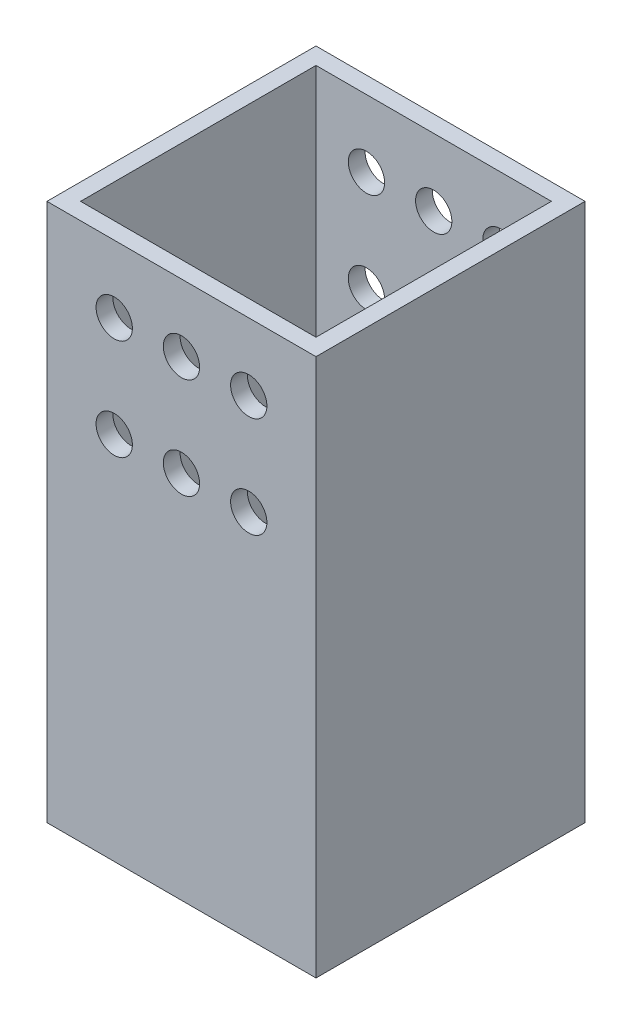
ISO-10303-21;
HEADER;
FILE_DESCRIPTION(('STEP AP214'),'2;1');
FILE_NAME('part.step','',(''),(''),'','','');
FILE_SCHEMA(('AUTOMOTIVE_DESIGN { 1 0 10303 214 1 1 1 1 }'));
ENDSEC;
DATA;
#1=APPLICATION_CONTEXT('core data for automotive mechanical design processes');
#2=APPLICATION_PROTOCOL_DEFINITION('international standard','automotive_design',2000,#1);
#3=PRODUCT_CONTEXT('',#1,'mechanical');
#4=PRODUCT('Part','Part','',(#3));
#5=PRODUCT_RELATED_PRODUCT_CATEGORY('part','',(#4));
#6=PRODUCT_DEFINITION_FORMATION('','',#4);
#7=PRODUCT_DEFINITION_CONTEXT('part definition',#1,'design');
#8=PRODUCT_DEFINITION('design','',#6,#7);
#9=PRODUCT_DEFINITION_SHAPE('','',#8);
#10=(LENGTH_UNIT() NAMED_UNIT(*) SI_UNIT(.MILLI.,.METRE.));
#11=(NAMED_UNIT(*) PLANE_ANGLE_UNIT() SI_UNIT($,.RADIAN.));
#12=(NAMED_UNIT(*) SI_UNIT($,.STERADIAN.) SOLID_ANGLE_UNIT());
#13=UNCERTAINTY_MEASURE_WITH_UNIT(LENGTH_MEASURE(1.E-05),#10,'distance_accuracy_value','');
#14=(GEOMETRIC_REPRESENTATION_CONTEXT(3) GLOBAL_UNCERTAINTY_ASSIGNED_CONTEXT((#13)) GLOBAL_UNIT_ASSIGNED_CONTEXT((#10,
#11,#12)) REPRESENTATION_CONTEXT('',''));
#15=CARTESIAN_POINT('',(0.,0.,0.));
#16=DIRECTION('',(0.,0.,1.));
#17=DIRECTION('',(1.,0.,0.));
#18=AXIS2_PLACEMENT_3D('',#15,#16,#17);
#19=CARTESIAN_POINT('',(0.,101.6,0.));
#20=DIRECTION('',(0.,-1.,0.));
#21=DIRECTION('',(0.,0.,-1.));
#22=AXIS2_PLACEMENT_3D('',#19,#20,#21);
#23=PLANE('',#22);
#24=DIRECTION('',(0.,0.,-1.));
#25=VECTOR('',#24,1.);
#26=CARTESIAN_POINT('',(25.4,101.6,25.4));
#27=LINE('',#26,#25);
#28=CARTESIAN_POINT('',(25.4,101.6,25.4));
#29=VERTEX_POINT('',#28);
#30=CARTESIAN_POINT('',(25.4,101.6,-25.4));
#31=VERTEX_POINT('',#30);
#32=EDGE_CURVE('E143',#29,#31,#27,.T.);
#33=ORIENTED_EDGE('',*,*,#32,.T.);
#34=DIRECTION('',(-1.,0.,0.));
#35=VECTOR('',#34,1.);
#36=CARTESIAN_POINT('',(-25.4,101.6,-25.4));
#37=LINE('',#36,#35);
#38=CARTESIAN_POINT('',(-25.4,101.6,-25.4));
#39=VERTEX_POINT('',#38);
#40=EDGE_CURVE('E146',#31,#39,#37,.T.);
#41=ORIENTED_EDGE('',*,*,#40,.T.);
#42=DIRECTION('',(0.,0.,1.));
#43=VECTOR('',#42,1.);
#44=CARTESIAN_POINT('',(-25.4,101.6,25.4));
#45=LINE('',#44,#43);
#46=CARTESIAN_POINT('',(-25.4,101.6,25.4));
#47=VERTEX_POINT('',#46);
#48=EDGE_CURVE('E149',#39,#47,#45,.T.);
#49=ORIENTED_EDGE('',*,*,#48,.T.);
#50=DIRECTION('',(1.,0.,0.));
#51=VECTOR('',#50,1.);
#52=CARTESIAN_POINT('',(-25.4,101.6,25.4));
#53=LINE('',#52,#51);
#54=EDGE_CURVE('E151',#47,#29,#53,.T.);
#55=ORIENTED_EDGE('',*,*,#54,.T.);
#56=EDGE_LOOP('',(#33,#41,#49,#55));
#57=FACE_BOUND('',#56,.T.);
#58=DIRECTION('',(0.,0.,-1.));
#59=VECTOR('',#58,1.);
#60=CARTESIAN_POINT('',(22.225,101.6,22.225));
#61=LINE('',#60,#59);
#62=CARTESIAN_POINT('',(22.225,101.6,22.225));
#63=VERTEX_POINT('',#62);
#64=CARTESIAN_POINT('',(22.225,101.6,-22.225));
#65=VERTEX_POINT('',#64);
#66=EDGE_CURVE('E105',#63,#65,#61,.T.);
#67=ORIENTED_EDGE('',*,*,#66,.F.);
#68=DIRECTION('',(1.,0.,0.));
#69=VECTOR('',#68,1.);
#70=CARTESIAN_POINT('',(-22.225,101.6,22.225));
#71=LINE('',#70,#69);
#72=CARTESIAN_POINT('',(-22.225,101.6,22.225));
#73=VERTEX_POINT('',#72);
#74=EDGE_CURVE('E127',#73,#63,#71,.T.);
#75=ORIENTED_EDGE('',*,*,#74,.F.);
#76=DIRECTION('',(0.,0.,1.));
#77=VECTOR('',#76,1.);
#78=CARTESIAN_POINT('',(-22.225,101.6,22.225));
#79=LINE('',#78,#77);
#80=CARTESIAN_POINT('',(-22.225,101.6,-22.225));
#81=VERTEX_POINT('',#80);
#82=EDGE_CURVE('E125',#81,#73,#79,.T.);
#83=ORIENTED_EDGE('',*,*,#82,.F.);
#84=DIRECTION('',(-1.,0.,0.));
#85=VECTOR('',#84,1.);
#86=CARTESIAN_POINT('',(-22.225,101.6,-22.225));
#87=LINE('',#86,#85);
#88=EDGE_CURVE('E113',#65,#81,#87,.T.);
#89=ORIENTED_EDGE('',*,*,#88,.F.);
#90=EDGE_LOOP('',(#67,#75,#83,#89));
#91=FACE_BOUND('',#90,.T.);
#92=ADVANCED_FACE('F39',(#57,#91),#23,.F.);
#93=CARTESIAN_POINT('',(0.,0.,0.));
#94=DIRECTION('',(0.,-1.,0.));
#95=DIRECTION('',(0.,0.,-1.));
#96=AXIS2_PLACEMENT_3D('',#93,#94,#95);
#97=PLANE('',#96);
#98=DIRECTION('',(0.,0.,-1.));
#99=VECTOR('',#98,1.);
#100=CARTESIAN_POINT('',(25.4,0.,25.4));
#101=LINE('',#100,#99);
#102=CARTESIAN_POINT('',(25.4,0.,25.4));
#103=VERTEX_POINT('',#102);
#104=CARTESIAN_POINT('',(25.4,0.,-25.4));
#105=VERTEX_POINT('',#104);
#106=EDGE_CURVE('E121',#103,#105,#101,.T.);
#107=ORIENTED_EDGE('',*,*,#106,.F.);
#108=DIRECTION('',(1.,0.,0.));
#109=VECTOR('',#108,1.);
#110=CARTESIAN_POINT('',(-25.4,0.,25.4));
#111=LINE('',#110,#109);
#112=CARTESIAN_POINT('',(-25.4,0.,25.4));
#113=VERTEX_POINT('',#112);
#114=EDGE_CURVE('E147',#113,#103,#111,.T.);
#115=ORIENTED_EDGE('',*,*,#114,.F.);
#116=DIRECTION('',(0.,0.,1.));
#117=VECTOR('',#116,1.);
#118=CARTESIAN_POINT('',(-25.4,0.,25.4));
#119=LINE('',#118,#117);
#120=CARTESIAN_POINT('',(-25.4,0.,-25.4));
#121=VERTEX_POINT('',#120);
#122=EDGE_CURVE('E158',#121,#113,#119,.T.);
#123=ORIENTED_EDGE('',*,*,#122,.F.);
#124=DIRECTION('',(-1.,0.,0.));
#125=VECTOR('',#124,1.);
#126=CARTESIAN_POINT('',(-25.4,0.,-25.4));
#127=LINE('',#126,#125);
#128=EDGE_CURVE('E156',#105,#121,#127,.T.);
#129=ORIENTED_EDGE('',*,*,#128,.F.);
#130=EDGE_LOOP('',(#107,#115,#123,#129));
#131=FACE_BOUND('',#130,.T.);
#132=DIRECTION('',(1.,0.,0.));
#133=VECTOR('',#132,1.);
#134=CARTESIAN_POINT('',(-22.225,0.,22.225));
#135=LINE('',#134,#133);
#136=CARTESIAN_POINT('',(-22.225,0.,22.225));
#137=VERTEX_POINT('',#136);
#138=CARTESIAN_POINT('',(22.225,0.,22.225));
#139=VERTEX_POINT('',#138);
#140=EDGE_CURVE('E114',#137,#139,#135,.T.);
#141=ORIENTED_EDGE('',*,*,#140,.T.);
#142=DIRECTION('',(0.,0.,-1.));
#143=VECTOR('',#142,1.);
#144=CARTESIAN_POINT('',(22.225,0.,22.225));
#145=LINE('',#144,#143);
#146=CARTESIAN_POINT('',(22.225,0.,-22.225));
#147=VERTEX_POINT('',#146);
#148=EDGE_CURVE('E63',#139,#147,#145,.T.);
#149=ORIENTED_EDGE('',*,*,#148,.T.);
#150=DIRECTION('',(-1.,0.,0.));
#151=VECTOR('',#150,1.);
#152=CARTESIAN_POINT('',(-22.225,0.,-22.225));
#153=LINE('',#152,#151);
#154=CARTESIAN_POINT('',(-22.225,0.,-22.225));
#155=VERTEX_POINT('',#154);
#156=EDGE_CURVE('E120',#147,#155,#153,.T.);
#157=ORIENTED_EDGE('',*,*,#156,.T.);
#158=DIRECTION('',(0.,0.,1.));
#159=VECTOR('',#158,1.);
#160=CARTESIAN_POINT('',(-22.225,0.,22.225));
#161=LINE('',#160,#159);
#162=EDGE_CURVE('E135',#155,#137,#161,.T.);
#163=ORIENTED_EDGE('',*,*,#162,.T.);
#164=EDGE_LOOP('',(#141,#149,#157,#163));
#165=FACE_BOUND('',#164,.T.);
#166=ADVANCED_FACE('F177',(#131,#165),#97,.T.);
#167=CARTESIAN_POINT('',(25.4,101.6,25.4));
#168=DIRECTION('',(-1.,0.,0.));
#169=DIRECTION('',(0.,0.,1.));
#170=AXIS2_PLACEMENT_3D('',#167,#168,#169);
#171=PLANE('',#170);
#172=ORIENTED_EDGE('',*,*,#106,.T.);
#173=DIRECTION('',(0.,-1.,0.));
#174=VECTOR('',#173,1.);
#175=CARTESIAN_POINT('',(25.4,101.6,-25.4));
#176=LINE('',#175,#174);
#177=EDGE_CURVE('E11',#31,#105,#176,.T.);
#178=ORIENTED_EDGE('',*,*,#177,.F.);
#179=ORIENTED_EDGE('',*,*,#32,.F.);
#180=DIRECTION('',(0.,-1.,0.));
#181=VECTOR('',#180,1.);
#182=CARTESIAN_POINT('',(25.4,101.6,25.4));
#183=LINE('',#182,#181);
#184=EDGE_CURVE('E153',#29,#103,#183,.T.);
#185=ORIENTED_EDGE('',*,*,#184,.T.);
#186=EDGE_LOOP('',(#172,#178,#179,#185));
#187=FACE_BOUND('',#186,.T.);
#188=ADVANCED_FACE('F41',(#187),#171,.F.);
#189=CARTESIAN_POINT('',(-25.4,101.6,-25.4));
#190=DIRECTION('',(0.,0.,1.));
#191=DIRECTION('',(1.,0.,0.));
#192=AXIS2_PLACEMENT_3D('',#189,#190,#191);
#193=PLANE('',#192);
#194=CARTESIAN_POINT('',(12.7,88.9,-25.4));
#195=DIRECTION('',(0.,0.,1.));
#196=DIRECTION('',(1.,0.,0.));
#197=AXIS2_PLACEMENT_3D('',#194,#195,#196);
#198=CIRCLE('',#197,3.42900000000001);
#199=CARTESIAN_POINT('',(16.129,88.9,-25.4));
#200=VERTEX_POINT('',#199);
#201=EDGE_CURVE('E309',#200,#200,#198,.T.);
#202=ORIENTED_EDGE('',*,*,#201,.T.);
#203=EDGE_LOOP('',(#202));
#204=FACE_BOUND('',#203,.T.);
#205=CARTESIAN_POINT('',(0.,88.9,-25.4));
#206=DIRECTION('',(0.,0.,1.));
#207=DIRECTION('',(1.,0.,0.));
#208=AXIS2_PLACEMENT_3D('',#205,#206,#207);
#209=CIRCLE('',#208,3.42900000000001);
#210=CARTESIAN_POINT('',(3.42900000000001,88.9,-25.4));
#211=VERTEX_POINT('',#210);
#212=EDGE_CURVE('E305',#211,#211,#209,.T.);
#213=ORIENTED_EDGE('',*,*,#212,.T.);
#214=EDGE_LOOP('',(#213));
#215=FACE_BOUND('',#214,.T.);
#216=CARTESIAN_POINT('',(-12.7,88.9,-25.4));
#217=DIRECTION('',(0.,0.,1.));
#218=DIRECTION('',(1.,0.,0.));
#219=AXIS2_PLACEMENT_3D('',#216,#217,#218);
#220=CIRCLE('',#219,3.42900000000001);
#221=CARTESIAN_POINT('',(-9.27099999999999,88.9,-25.4));
#222=VERTEX_POINT('',#221);
#223=EDGE_CURVE('E301',#222,#222,#220,.T.);
#224=ORIENTED_EDGE('',*,*,#223,.T.);
#225=EDGE_LOOP('',(#224));
#226=FACE_BOUND('',#225,.T.);
#227=CARTESIAN_POINT('',(12.7,69.85,-25.4));
#228=DIRECTION('',(0.,0.,1.));
#229=DIRECTION('',(1.,0.,0.));
#230=AXIS2_PLACEMENT_3D('',#227,#228,#229);
#231=CIRCLE('',#230,3.42900000000001);
#232=CARTESIAN_POINT('',(16.129,69.85,-25.4));
#233=VERTEX_POINT('',#232);
#234=EDGE_CURVE('E296',#233,#233,#231,.T.);
#235=ORIENTED_EDGE('',*,*,#234,.T.);
#236=EDGE_LOOP('',(#235));
#237=FACE_BOUND('',#236,.T.);
#238=CARTESIAN_POINT('',(0.,69.85,-25.4));
#239=DIRECTION('',(0.,0.,1.));
#240=DIRECTION('',(1.,0.,0.));
#241=AXIS2_PLACEMENT_3D('',#238,#239,#240);
#242=CIRCLE('',#241,3.42900000000001);
#243=CARTESIAN_POINT('',(3.42900000000001,69.85,-25.4));
#244=VERTEX_POINT('',#243);
#245=EDGE_CURVE('E235',#244,#244,#242,.T.);
#246=ORIENTED_EDGE('',*,*,#245,.T.);
#247=EDGE_LOOP('',(#246));
#248=FACE_BOUND('',#247,.T.);
#249=CARTESIAN_POINT('',(-12.7,69.85,-25.4));
#250=DIRECTION('',(0.,0.,1.));
#251=DIRECTION('',(1.,0.,0.));
#252=AXIS2_PLACEMENT_3D('',#249,#250,#251);
#253=CIRCLE('',#252,3.42900000000001);
#254=CARTESIAN_POINT('',(-9.27099999999999,69.85,-25.4));
#255=VERTEX_POINT('',#254);
#256=EDGE_CURVE('E133',#255,#255,#253,.T.);
#257=ORIENTED_EDGE('',*,*,#256,.T.);
#258=EDGE_LOOP('',(#257));
#259=FACE_BOUND('',#258,.T.);
#260=ORIENTED_EDGE('',*,*,#128,.T.);
#261=DIRECTION('',(0.,-1.,0.));
#262=VECTOR('',#261,1.);
#263=CARTESIAN_POINT('',(-25.4,101.6,-25.4));
#264=LINE('',#263,#262);
#265=EDGE_CURVE('E48',#39,#121,#264,.T.);
#266=ORIENTED_EDGE('',*,*,#265,.F.);
#267=ORIENTED_EDGE('',*,*,#40,.F.);
#268=ORIENTED_EDGE('',*,*,#177,.T.);
#269=EDGE_LOOP('',(#260,#266,#267,#268));
#270=FACE_BOUND('',#269,.T.);
#271=ADVANCED_FACE('F187',(#204,#215,#226,#237,#248,#259,#270),#193,.F.);
#272=CARTESIAN_POINT('',(-25.4,101.6,25.4));
#273=DIRECTION('',(1.,0.,0.));
#274=DIRECTION('',(0.,0.,-1.));
#275=AXIS2_PLACEMENT_3D('',#272,#273,#274);
#276=PLANE('',#275);
#277=ORIENTED_EDGE('',*,*,#122,.T.);
#278=DIRECTION('',(0.,-1.,0.));
#279=VECTOR('',#278,1.);
#280=CARTESIAN_POINT('',(-25.4,101.6,25.4));
#281=LINE('',#280,#279);
#282=EDGE_CURVE('E163',#47,#113,#281,.T.);
#283=ORIENTED_EDGE('',*,*,#282,.F.);
#284=ORIENTED_EDGE('',*,*,#48,.F.);
#285=ORIENTED_EDGE('',*,*,#265,.T.);
#286=EDGE_LOOP('',(#277,#283,#284,#285));
#287=FACE_BOUND('',#286,.T.);
#288=ADVANCED_FACE('F171',(#287),#276,.F.);
#289=CARTESIAN_POINT('',(-25.4,101.6,25.4));
#290=DIRECTION('',(0.,0.,-1.));
#291=DIRECTION('',(-1.,0.,0.));
#292=AXIS2_PLACEMENT_3D('',#289,#290,#291);
#293=PLANE('',#292);
#294=CARTESIAN_POINT('',(12.7,88.9,25.4));
#295=DIRECTION('',(0.,0.,1.));
#296=DIRECTION('',(1.,0.,0.));
#297=AXIS2_PLACEMENT_3D('',#294,#295,#296);
#298=CIRCLE('',#297,3.42900000000001);
#299=CARTESIAN_POINT('',(16.129,88.9,25.4));
#300=VERTEX_POINT('',#299);
#301=EDGE_CURVE('E214',#300,#300,#298,.T.);
#302=ORIENTED_EDGE('',*,*,#301,.F.);
#303=EDGE_LOOP('',(#302));
#304=FACE_BOUND('',#303,.T.);
#305=CARTESIAN_POINT('',(0.,88.9,25.4));
#306=DIRECTION('',(0.,0.,1.));
#307=DIRECTION('',(1.,0.,0.));
#308=AXIS2_PLACEMENT_3D('',#305,#306,#307);
#309=CIRCLE('',#308,3.42900000000001);
#310=CARTESIAN_POINT('',(3.42900000000001,88.9,25.4));
#311=VERTEX_POINT('',#310);
#312=EDGE_CURVE('E218',#311,#311,#309,.T.);
#313=ORIENTED_EDGE('',*,*,#312,.F.);
#314=EDGE_LOOP('',(#313));
#315=FACE_BOUND('',#314,.T.);
#316=CARTESIAN_POINT('',(-12.7,88.9,25.4));
#317=DIRECTION('',(0.,0.,1.));
#318=DIRECTION('',(1.,0.,0.));
#319=AXIS2_PLACEMENT_3D('',#316,#317,#318);
#320=CIRCLE('',#319,3.42900000000001);
#321=CARTESIAN_POINT('',(-9.27099999999999,88.9,25.4));
#322=VERTEX_POINT('',#321);
#323=EDGE_CURVE('E222',#322,#322,#320,.T.);
#324=ORIENTED_EDGE('',*,*,#323,.F.);
#325=EDGE_LOOP('',(#324));
#326=FACE_BOUND('',#325,.T.);
#327=CARTESIAN_POINT('',(12.7,69.85,25.4));
#328=DIRECTION('',(0.,0.,1.));
#329=DIRECTION('',(1.,0.,0.));
#330=AXIS2_PLACEMENT_3D('',#327,#328,#329);
#331=CIRCLE('',#330,3.42900000000001);
#332=CARTESIAN_POINT('',(16.129,69.85,25.4));
#333=VERTEX_POINT('',#332);
#334=EDGE_CURVE('E226',#333,#333,#331,.T.);
#335=ORIENTED_EDGE('',*,*,#334,.F.);
#336=EDGE_LOOP('',(#335));
#337=FACE_BOUND('',#336,.T.);
#338=CARTESIAN_POINT('',(0.,69.85,25.4));
#339=DIRECTION('',(0.,0.,1.));
#340=DIRECTION('',(1.,0.,0.));
#341=AXIS2_PLACEMENT_3D('',#338,#339,#340);
#342=CIRCLE('',#341,3.42900000000001);
#343=CARTESIAN_POINT('',(3.42900000000001,69.85,25.4));
#344=VERTEX_POINT('',#343);
#345=EDGE_CURVE('E230',#344,#344,#342,.T.);
#346=ORIENTED_EDGE('',*,*,#345,.F.);
#347=EDGE_LOOP('',(#346));
#348=FACE_BOUND('',#347,.T.);
#349=CARTESIAN_POINT('',(-12.7,69.85,25.4));
#350=DIRECTION('',(0.,0.,1.));
#351=DIRECTION('',(1.,0.,0.));
#352=AXIS2_PLACEMENT_3D('',#349,#350,#351);
#353=CIRCLE('',#352,3.42900000000001);
#354=CARTESIAN_POINT('',(-9.27099999999999,69.85,25.4));
#355=VERTEX_POINT('',#354);
#356=EDGE_CURVE('E233',#355,#355,#353,.T.);
#357=ORIENTED_EDGE('',*,*,#356,.F.);
#358=EDGE_LOOP('',(#357));
#359=FACE_BOUND('',#358,.T.);
#360=ORIENTED_EDGE('',*,*,#114,.T.);
#361=ORIENTED_EDGE('',*,*,#184,.F.);
#362=ORIENTED_EDGE('',*,*,#54,.F.);
#363=ORIENTED_EDGE('',*,*,#282,.T.);
#364=EDGE_LOOP('',(#360,#361,#362,#363));
#365=FACE_BOUND('',#364,.T.);
#366=ADVANCED_FACE('F181',(#304,#315,#326,#337,#348,#359,#365),#293,.F.);
#367=CARTESIAN_POINT('',(22.225,101.6,22.225));
#368=DIRECTION('',(-1.,0.,0.));
#369=DIRECTION('',(0.,0.,1.));
#370=AXIS2_PLACEMENT_3D('',#367,#368,#369);
#371=PLANE('',#370);
#372=ORIENTED_EDGE('',*,*,#148,.F.);
#373=DIRECTION('',(0.,-1.,0.));
#374=VECTOR('',#373,1.);
#375=CARTESIAN_POINT('',(22.225,101.6,22.225));
#376=LINE('',#375,#374);
#377=EDGE_CURVE('E109',#63,#139,#376,.T.);
#378=ORIENTED_EDGE('',*,*,#377,.F.);
#379=ORIENTED_EDGE('',*,*,#66,.T.);
#380=DIRECTION('',(0.,-1.,0.));
#381=VECTOR('',#380,1.);
#382=CARTESIAN_POINT('',(22.225,101.6,-22.225));
#383=LINE('',#382,#381);
#384=EDGE_CURVE('E108',#65,#147,#383,.T.);
#385=ORIENTED_EDGE('',*,*,#384,.T.);
#386=EDGE_LOOP('',(#372,#378,#379,#385));
#387=FACE_BOUND('',#386,.T.);
#388=ADVANCED_FACE('F107',(#387),#371,.T.);
#389=CARTESIAN_POINT('',(-22.225,101.6,-22.225));
#390=DIRECTION('',(0.,0.,1.));
#391=DIRECTION('',(1.,0.,0.));
#392=AXIS2_PLACEMENT_3D('',#389,#390,#391);
#393=PLANE('',#392);
#394=CARTESIAN_POINT('',(12.7,88.9,-22.225));
#395=DIRECTION('',(0.,0.,1.));
#396=DIRECTION('',(1.,0.,0.));
#397=AXIS2_PLACEMENT_3D('',#394,#395,#396);
#398=CIRCLE('',#397,3.42900000000001);
#399=CARTESIAN_POINT('',(16.129,88.9,-22.225));
#400=VERTEX_POINT('',#399);
#401=EDGE_CURVE('E279',#400,#400,#398,.T.);
#402=ORIENTED_EDGE('',*,*,#401,.F.);
#403=EDGE_LOOP('',(#402));
#404=FACE_BOUND('',#403,.T.);
#405=CARTESIAN_POINT('',(0.,88.9,-22.225));
#406=DIRECTION('',(0.,0.,1.));
#407=DIRECTION('',(1.,0.,0.));
#408=AXIS2_PLACEMENT_3D('',#405,#406,#407);
#409=CIRCLE('',#408,3.42900000000001);
#410=CARTESIAN_POINT('',(3.42900000000001,88.9,-22.225));
#411=VERTEX_POINT('',#410);
#412=EDGE_CURVE('E283',#411,#411,#409,.T.);
#413=ORIENTED_EDGE('',*,*,#412,.F.);
#414=EDGE_LOOP('',(#413));
#415=FACE_BOUND('',#414,.T.);
#416=CARTESIAN_POINT('',(-12.7,88.9,-22.225));
#417=DIRECTION('',(0.,0.,1.));
#418=DIRECTION('',(1.,0.,0.));
#419=AXIS2_PLACEMENT_3D('',#416,#417,#418);
#420=CIRCLE('',#419,3.42900000000001);
#421=CARTESIAN_POINT('',(-9.27099999999999,88.9,-22.225));
#422=VERTEX_POINT('',#421);
#423=EDGE_CURVE('E287',#422,#422,#420,.T.);
#424=ORIENTED_EDGE('',*,*,#423,.F.);
#425=EDGE_LOOP('',(#424));
#426=FACE_BOUND('',#425,.T.);
#427=CARTESIAN_POINT('',(12.7,69.85,-22.225));
#428=DIRECTION('',(0.,0.,1.));
#429=DIRECTION('',(1.,0.,0.));
#430=AXIS2_PLACEMENT_3D('',#427,#428,#429);
#431=CIRCLE('',#430,3.42900000000001);
#432=CARTESIAN_POINT('',(16.129,69.85,-22.225));
#433=VERTEX_POINT('',#432);
#434=EDGE_CURVE('E291',#433,#433,#431,.T.);
#435=ORIENTED_EDGE('',*,*,#434,.F.);
#436=EDGE_LOOP('',(#435));
#437=FACE_BOUND('',#436,.T.);
#438=CARTESIAN_POINT('',(0.,69.85,-22.225));
#439=DIRECTION('',(0.,0.,1.));
#440=DIRECTION('',(1.,0.,0.));
#441=AXIS2_PLACEMENT_3D('',#438,#439,#440);
#442=CIRCLE('',#441,3.42900000000001);
#443=CARTESIAN_POINT('',(3.42900000000001,69.85,-22.225));
#444=VERTEX_POINT('',#443);
#445=EDGE_CURVE('E240',#444,#444,#442,.T.);
#446=ORIENTED_EDGE('',*,*,#445,.F.);
#447=EDGE_LOOP('',(#446));
#448=FACE_BOUND('',#447,.T.);
#449=CARTESIAN_POINT('',(-12.7,69.85,-22.225));
#450=DIRECTION('',(0.,0.,1.));
#451=DIRECTION('',(1.,0.,0.));
#452=AXIS2_PLACEMENT_3D('',#449,#450,#451);
#453=CIRCLE('',#452,3.42900000000001);
#454=CARTESIAN_POINT('',(-9.27099999999999,69.85,-22.225));
#455=VERTEX_POINT('',#454);
#456=EDGE_CURVE('E238',#455,#455,#453,.T.);
#457=ORIENTED_EDGE('',*,*,#456,.F.);
#458=EDGE_LOOP('',(#457));
#459=FACE_BOUND('',#458,.T.);
#460=ORIENTED_EDGE('',*,*,#156,.F.);
#461=ORIENTED_EDGE('',*,*,#384,.F.);
#462=ORIENTED_EDGE('',*,*,#88,.T.);
#463=DIRECTION('',(0.,-1.,0.));
#464=VECTOR('',#463,1.);
#465=CARTESIAN_POINT('',(-22.225,101.6,-22.225));
#466=LINE('',#465,#464);
#467=EDGE_CURVE('E122',#81,#155,#466,.T.);
#468=ORIENTED_EDGE('',*,*,#467,.T.);
#469=EDGE_LOOP('',(#460,#461,#462,#468));
#470=FACE_BOUND('',#469,.T.);
#471=ADVANCED_FACE('F117',(#404,#415,#426,#437,#448,#459,#470),#393,.T.);
#472=CARTESIAN_POINT('',(-22.225,101.6,22.225));
#473=DIRECTION('',(1.,0.,0.));
#474=DIRECTION('',(0.,0.,-1.));
#475=AXIS2_PLACEMENT_3D('',#472,#473,#474);
#476=PLANE('',#475);
#477=ORIENTED_EDGE('',*,*,#162,.F.);
#478=ORIENTED_EDGE('',*,*,#467,.F.);
#479=ORIENTED_EDGE('',*,*,#82,.T.);
#480=DIRECTION('',(0.,-1.,0.));
#481=VECTOR('',#480,1.);
#482=CARTESIAN_POINT('',(-22.225,101.6,22.225));
#483=LINE('',#482,#481);
#484=EDGE_CURVE('E55',#73,#137,#483,.T.);
#485=ORIENTED_EDGE('',*,*,#484,.T.);
#486=EDGE_LOOP('',(#477,#478,#479,#485));
#487=FACE_BOUND('',#486,.T.);
#488=ADVANCED_FACE('F268',(#487),#476,.T.);
#489=CARTESIAN_POINT('',(-22.225,101.6,22.225));
#490=DIRECTION('',(0.,0.,-1.));
#491=DIRECTION('',(-1.,0.,0.));
#492=AXIS2_PLACEMENT_3D('',#489,#490,#491);
#493=PLANE('',#492);
#494=CARTESIAN_POINT('',(12.7,88.9,22.225));
#495=DIRECTION('',(0.,0.,-1.));
#496=DIRECTION('',(-1.,0.,0.));
#497=AXIS2_PLACEMENT_3D('',#494,#495,#496);
#498=CIRCLE('',#497,3.42900000000001);
#499=CARTESIAN_POINT('',(9.271,88.9,22.225));
#500=VERTEX_POINT('',#499);
#501=EDGE_CURVE('E329',#500,#500,#498,.T.);
#502=ORIENTED_EDGE('',*,*,#501,.F.);
#503=EDGE_LOOP('',(#502));
#504=FACE_BOUND('',#503,.T.);
#505=CARTESIAN_POINT('',(0.,88.9,22.225));
#506=DIRECTION('',(0.,0.,-1.));
#507=DIRECTION('',(-1.,0.,0.));
#508=AXIS2_PLACEMENT_3D('',#505,#506,#507);
#509=CIRCLE('',#508,3.42900000000001);
#510=CARTESIAN_POINT('',(-3.429,88.9,22.225));
#511=VERTEX_POINT('',#510);
#512=EDGE_CURVE('E325',#511,#511,#509,.T.);
#513=ORIENTED_EDGE('',*,*,#512,.F.);
#514=EDGE_LOOP('',(#513));
#515=FACE_BOUND('',#514,.T.);
#516=CARTESIAN_POINT('',(-12.7,88.9,22.225));
#517=DIRECTION('',(0.,0.,-1.));
#518=DIRECTION('',(-1.,0.,0.));
#519=AXIS2_PLACEMENT_3D('',#516,#517,#518);
#520=CIRCLE('',#519,3.42900000000001);
#521=CARTESIAN_POINT('',(-16.129,88.9,22.225));
#522=VERTEX_POINT('',#521);
#523=EDGE_CURVE('E321',#522,#522,#520,.T.);
#524=ORIENTED_EDGE('',*,*,#523,.F.);
#525=EDGE_LOOP('',(#524));
#526=FACE_BOUND('',#525,.T.);
#527=CARTESIAN_POINT('',(12.7,69.85,22.225));
#528=DIRECTION('',(0.,0.,-1.));
#529=DIRECTION('',(-1.,0.,0.));
#530=AXIS2_PLACEMENT_3D('',#527,#528,#529);
#531=CIRCLE('',#530,3.42900000000001);
#532=CARTESIAN_POINT('',(9.271,69.85,22.225));
#533=VERTEX_POINT('',#532);
#534=EDGE_CURVE('E317',#533,#533,#531,.T.);
#535=ORIENTED_EDGE('',*,*,#534,.F.);
#536=EDGE_LOOP('',(#535));
#537=FACE_BOUND('',#536,.T.);
#538=CARTESIAN_POINT('',(0.,69.85,22.225));
#539=DIRECTION('',(0.,0.,-1.));
#540=DIRECTION('',(-1.,0.,0.));
#541=AXIS2_PLACEMENT_3D('',#538,#539,#540);
#542=CIRCLE('',#541,3.42900000000001);
#543=CARTESIAN_POINT('',(-3.429,69.85,22.225));
#544=VERTEX_POINT('',#543);
#545=EDGE_CURVE('E313',#544,#544,#542,.T.);
#546=ORIENTED_EDGE('',*,*,#545,.F.);
#547=EDGE_LOOP('',(#546));
#548=FACE_BOUND('',#547,.T.);
#549=CARTESIAN_POINT('',(-12.7,69.85,22.225));
#550=DIRECTION('',(0.,0.,-1.));
#551=DIRECTION('',(-1.,0.,0.));
#552=AXIS2_PLACEMENT_3D('',#549,#550,#551);
#553=CIRCLE('',#552,3.42900000000001);
#554=CARTESIAN_POINT('',(-16.129,69.85,22.225));
#555=VERTEX_POINT('',#554);
#556=EDGE_CURVE('E43',#555,#555,#553,.T.);
#557=ORIENTED_EDGE('',*,*,#556,.F.);
#558=EDGE_LOOP('',(#557));
#559=FACE_BOUND('',#558,.T.);
#560=ORIENTED_EDGE('',*,*,#140,.F.);
#561=ORIENTED_EDGE('',*,*,#484,.F.);
#562=ORIENTED_EDGE('',*,*,#74,.T.);
#563=ORIENTED_EDGE('',*,*,#377,.T.);
#564=EDGE_LOOP('',(#560,#561,#562,#563));
#565=FACE_BOUND('',#564,.T.);
#566=ADVANCED_FACE('F262',(#504,#515,#526,#537,#548,#559,#565),#493,.T.);
#567=CARTESIAN_POINT('',(-12.7,69.85,-76.2));
#568=DIRECTION('',(0.,0.,1.));
#569=DIRECTION('',(1.,0.,0.));
#570=AXIS2_PLACEMENT_3D('',#567,#568,#569);
#571=CYLINDRICAL_SURFACE('',#570,3.42900000000001);
#572=ORIENTED_EDGE('',*,*,#556,.T.);
#573=EDGE_LOOP('',(#572));
#574=FACE_BOUND('',#573,.T.);
#575=ORIENTED_EDGE('',*,*,#356,.T.);
#576=EDGE_LOOP('',(#575));
#577=FACE_BOUND('',#576,.T.);
#578=ADVANCED_FACE('F252',(#574,#577),#571,.F.);
#579=ORIENTED_EDGE('',*,*,#456,.T.);
#580=EDGE_LOOP('',(#579));
#581=FACE_BOUND('',#580,.T.);
#582=ORIENTED_EDGE('',*,*,#256,.F.);
#583=EDGE_LOOP('',(#582));
#584=FACE_BOUND('',#583,.T.);
#585=ADVANCED_FACE('F249',(#581,#584),#571,.F.);
#586=CARTESIAN_POINT('',(0.,69.85,-76.2));
#587=DIRECTION('',(0.,0.,1.));
#588=DIRECTION('',(1.,0.,0.));
#589=AXIS2_PLACEMENT_3D('',#586,#587,#588);
#590=CYLINDRICAL_SURFACE('',#589,3.42900000000001);
#591=ORIENTED_EDGE('',*,*,#445,.T.);
#592=EDGE_LOOP('',(#591));
#593=FACE_BOUND('',#592,.T.);
#594=ORIENTED_EDGE('',*,*,#245,.F.);
#595=EDGE_LOOP('',(#594));
#596=FACE_BOUND('',#595,.T.);
#597=ADVANCED_FACE('F251',(#593,#596),#590,.F.);
#598=CARTESIAN_POINT('',(12.7,69.85,-76.2));
#599=DIRECTION('',(0.,0.,1.));
#600=DIRECTION('',(1.,0.,0.));
#601=AXIS2_PLACEMENT_3D('',#598,#599,#600);
#602=CYLINDRICAL_SURFACE('',#601,3.42900000000001);
#603=ORIENTED_EDGE('',*,*,#434,.T.);
#604=EDGE_LOOP('',(#603));
#605=FACE_BOUND('',#604,.T.);
#606=ORIENTED_EDGE('',*,*,#234,.F.);
#607=EDGE_LOOP('',(#606));
#608=FACE_BOUND('',#607,.T.);
#609=ADVANCED_FACE('F259',(#605,#608),#602,.F.);
#610=CARTESIAN_POINT('',(-12.7,88.9,-76.2));
#611=DIRECTION('',(0.,0.,1.));
#612=DIRECTION('',(1.,0.,0.));
#613=AXIS2_PLACEMENT_3D('',#610,#611,#612);
#614=CYLINDRICAL_SURFACE('',#613,3.42900000000001);
#615=ORIENTED_EDGE('',*,*,#423,.T.);
#616=EDGE_LOOP('',(#615));
#617=FACE_BOUND('',#616,.T.);
#618=ORIENTED_EDGE('',*,*,#223,.F.);
#619=EDGE_LOOP('',(#618));
#620=FACE_BOUND('',#619,.T.);
#621=ADVANCED_FACE('F367',(#617,#620),#614,.F.);
#622=CARTESIAN_POINT('',(0.,88.9,-76.2));
#623=DIRECTION('',(0.,0.,1.));
#624=DIRECTION('',(1.,0.,0.));
#625=AXIS2_PLACEMENT_3D('',#622,#623,#624);
#626=CYLINDRICAL_SURFACE('',#625,3.42900000000001);
#627=ORIENTED_EDGE('',*,*,#412,.T.);
#628=EDGE_LOOP('',(#627));
#629=FACE_BOUND('',#628,.T.);
#630=ORIENTED_EDGE('',*,*,#212,.F.);
#631=EDGE_LOOP('',(#630));
#632=FACE_BOUND('',#631,.T.);
#633=ADVANCED_FACE('F360',(#629,#632),#626,.F.);
#634=CARTESIAN_POINT('',(12.7,88.9,-76.2));
#635=DIRECTION('',(0.,0.,1.));
#636=DIRECTION('',(1.,0.,0.));
#637=AXIS2_PLACEMENT_3D('',#634,#635,#636);
#638=CYLINDRICAL_SURFACE('',#637,3.42900000000001);
#639=ORIENTED_EDGE('',*,*,#401,.T.);
#640=EDGE_LOOP('',(#639));
#641=FACE_BOUND('',#640,.T.);
#642=ORIENTED_EDGE('',*,*,#201,.F.);
#643=EDGE_LOOP('',(#642));
#644=FACE_BOUND('',#643,.T.);
#645=ADVANCED_FACE('F351',(#641,#644),#638,.F.);
#646=CARTESIAN_POINT('',(0.,69.85,-76.2));
#647=DIRECTION('',(0.,0.,1.));
#648=DIRECTION('',(1.,0.,0.));
#649=AXIS2_PLACEMENT_3D('',#646,#647,#648);
#650=CYLINDRICAL_SURFACE('',#649,3.42900000000001);
#651=ORIENTED_EDGE('',*,*,#545,.T.);
#652=EDGE_LOOP('',(#651));
#653=FACE_BOUND('',#652,.T.);
#654=ORIENTED_EDGE('',*,*,#345,.T.);
#655=EDGE_LOOP('',(#654));
#656=FACE_BOUND('',#655,.T.);
#657=ADVANCED_FACE('F347',(#653,#656),#650,.F.);
#658=CARTESIAN_POINT('',(12.7,69.85,-76.2));
#659=DIRECTION('',(0.,0.,1.));
#660=DIRECTION('',(1.,0.,0.));
#661=AXIS2_PLACEMENT_3D('',#658,#659,#660);
#662=CYLINDRICAL_SURFACE('',#661,3.42900000000001);
#663=ORIENTED_EDGE('',*,*,#534,.T.);
#664=EDGE_LOOP('',(#663));
#665=FACE_BOUND('',#664,.T.);
#666=ORIENTED_EDGE('',*,*,#334,.T.);
#667=EDGE_LOOP('',(#666));
#668=FACE_BOUND('',#667,.T.);
#669=ADVANCED_FACE('F350',(#665,#668),#662,.F.);
#670=CARTESIAN_POINT('',(-12.7,88.9,-76.2));
#671=DIRECTION('',(0.,0.,1.));
#672=DIRECTION('',(1.,0.,0.));
#673=AXIS2_PLACEMENT_3D('',#670,#671,#672);
#674=CYLINDRICAL_SURFACE('',#673,3.42900000000001);
#675=ORIENTED_EDGE('',*,*,#523,.T.);
#676=EDGE_LOOP('',(#675));
#677=FACE_BOUND('',#676,.T.);
#678=ORIENTED_EDGE('',*,*,#323,.T.);
#679=EDGE_LOOP('',(#678));
#680=FACE_BOUND('',#679,.T.);
#681=ADVANCED_FACE('F357',(#677,#680),#674,.F.);
#682=CARTESIAN_POINT('',(0.,88.9,-76.2));
#683=DIRECTION('',(0.,0.,1.));
#684=DIRECTION('',(1.,0.,0.));
#685=AXIS2_PLACEMENT_3D('',#682,#683,#684);
#686=CYLINDRICAL_SURFACE('',#685,3.42900000000001);
#687=ORIENTED_EDGE('',*,*,#512,.T.);
#688=EDGE_LOOP('',(#687));
#689=FACE_BOUND('',#688,.T.);
#690=ORIENTED_EDGE('',*,*,#312,.T.);
#691=EDGE_LOOP('',(#690));
#692=FACE_BOUND('',#691,.T.);
#693=ADVANCED_FACE('F417',(#689,#692),#686,.F.);
#694=CARTESIAN_POINT('',(12.7,88.9,-76.2));
#695=DIRECTION('',(0.,0.,1.));
#696=DIRECTION('',(1.,0.,0.));
#697=AXIS2_PLACEMENT_3D('',#694,#695,#696);
#698=CYLINDRICAL_SURFACE('',#697,3.42900000000001);
#699=ORIENTED_EDGE('',*,*,#501,.T.);
#700=EDGE_LOOP('',(#699));
#701=FACE_BOUND('',#700,.T.);
#702=ORIENTED_EDGE('',*,*,#301,.T.);
#703=EDGE_LOOP('',(#702));
#704=FACE_BOUND('',#703,.T.);
#705=ADVANCED_FACE('F333',(#701,#704),#698,.F.);
#706=CLOSED_SHELL('',(#92,#166,#188,#271,#288,#366,#388,#471,#488,#566,#578,#585,#597,#609,#621,
#633,#645,#657,#669,#681,#693,#705));
#707=MANIFOLD_SOLID_BREP('B2',#706);
#708=ADVANCED_BREP_SHAPE_REPRESENTATION('',(#18,#707),#14);
#709=SHAPE_DEFINITION_REPRESENTATION(#9,#708);
ENDSEC;
END-ISO-10303-21;
